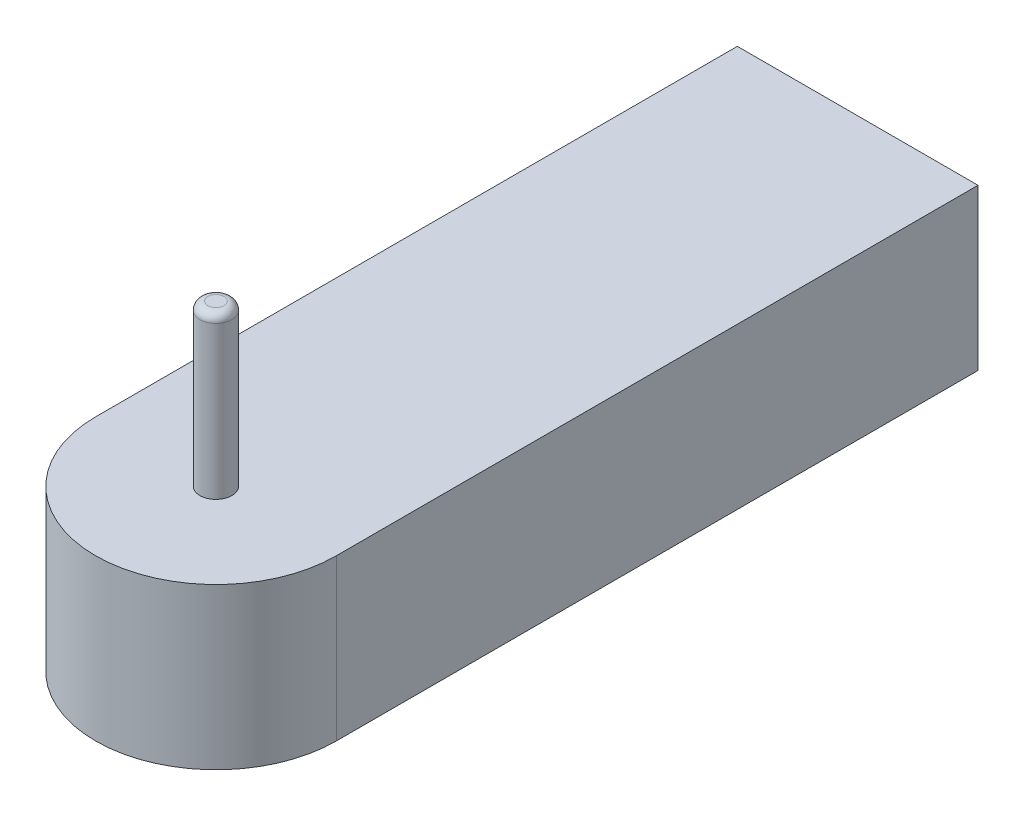
ISO-10303-21;
HEADER;
FILE_DESCRIPTION(('STEP AP214'),'2;1');
FILE_NAME('part.step','',(''),(''),'','','');
FILE_SCHEMA(('AUTOMOTIVE_DESIGN { 1 0 10303 214 1 1 1 1 }'));
ENDSEC;
DATA;
#1=APPLICATION_CONTEXT('core data for automotive mechanical design processes');
#2=APPLICATION_PROTOCOL_DEFINITION('international standard','automotive_design',2000,#1);
#3=PRODUCT_CONTEXT('',#1,'mechanical');
#4=PRODUCT('Part','Part','',(#3));
#5=PRODUCT_RELATED_PRODUCT_CATEGORY('part','',(#4));
#6=PRODUCT_DEFINITION_FORMATION('','',#4);
#7=PRODUCT_DEFINITION_CONTEXT('part definition',#1,'design');
#8=PRODUCT_DEFINITION('design','',#6,#7);
#9=PRODUCT_DEFINITION_SHAPE('','',#8);
#10=(LENGTH_UNIT() NAMED_UNIT(*) SI_UNIT(.MILLI.,.METRE.));
#11=(NAMED_UNIT(*) PLANE_ANGLE_UNIT() SI_UNIT($,.RADIAN.));
#12=(NAMED_UNIT(*) SI_UNIT($,.STERADIAN.) SOLID_ANGLE_UNIT());
#13=UNCERTAINTY_MEASURE_WITH_UNIT(LENGTH_MEASURE(1.E-05),#10,'distance_accuracy_value','');
#14=(GEOMETRIC_REPRESENTATION_CONTEXT(3) GLOBAL_UNCERTAINTY_ASSIGNED_CONTEXT((#13)) GLOBAL_UNIT_ASSIGNED_CONTEXT((#10,
#11,#12)) REPRESENTATION_CONTEXT('',''));
#15=CARTESIAN_POINT('',(0.,0.,0.));
#16=DIRECTION('',(0.,0.,1.));
#17=DIRECTION('',(1.,0.,0.));
#18=AXIS2_PLACEMENT_3D('',#15,#16,#17);
#19=CARTESIAN_POINT('',(75.0000000000001,100.,400.));
#20=DIRECTION('',(0.,1.,0.));
#21=DIRECTION('',(0.,0.,1.));
#22=AXIS2_PLACEMENT_3D('',#19,#20,#21);
#23=PLANE('',#22);
#24=DIRECTION('',(0.,0.,1.));
#25=VECTOR('',#24,1.);
#26=CARTESIAN_POINT('',(0.,100.,0.));
#27=LINE('',#26,#25);
#28=CARTESIAN_POINT('',(0.,100.,0.));
#29=VERTEX_POINT('',#28);
#30=CARTESIAN_POINT('',(0.,100.,400.));
#31=VERTEX_POINT('',#30);
#32=EDGE_CURVE('E89',#29,#31,#27,.T.);
#33=ORIENTED_EDGE('',*,*,#32,.T.);
#34=CARTESIAN_POINT('',(75.0000000000001,100.,400.));
#35=DIRECTION('',(0.,1.,0.));
#36=DIRECTION('',(0.,0.,1.));
#37=AXIS2_PLACEMENT_3D('',#34,#35,#36);
#38=CIRCLE('',#37,75.);
#39=CARTESIAN_POINT('',(150.,100.,400.));
#40=VERTEX_POINT('',#39);
#41=EDGE_CURVE('E84',#31,#40,#38,.T.);
#42=ORIENTED_EDGE('',*,*,#41,.T.);
#43=DIRECTION('',(0.,0.,-1.));
#44=VECTOR('',#43,1.);
#45=CARTESIAN_POINT('',(150.,100.,0.));
#46=LINE('',#45,#44);
#47=CARTESIAN_POINT('',(150.,100.,0.));
#48=VERTEX_POINT('',#47);
#49=EDGE_CURVE('E87',#40,#48,#46,.T.);
#50=ORIENTED_EDGE('',*,*,#49,.T.);
#51=DIRECTION('',(-1.,0.,0.));
#52=VECTOR('',#51,1.);
#53=CARTESIAN_POINT('',(0.,100.,0.));
#54=LINE('',#53,#52);
#55=EDGE_CURVE('E53',#48,#29,#54,.T.);
#56=ORIENTED_EDGE('',*,*,#55,.T.);
#57=EDGE_LOOP('',(#33,#42,#50,#56));
#58=FACE_BOUND('',#57,.T.);
#59=CARTESIAN_POINT('',(75.0000000000001,100.,400.));
#60=DIRECTION('',(0.,1.,0.));
#61=DIRECTION('',(0.,0.,1.));
#62=AXIS2_PLACEMENT_3D('',#59,#60,#61);
#63=CIRCLE('',#62,10.);
#64=CARTESIAN_POINT('',(75.0000000000001,100.,410.));
#65=VERTEX_POINT('',#64);
#66=EDGE_CURVE('E107',#65,#65,#63,.T.);
#67=ORIENTED_EDGE('',*,*,#66,.F.);
#68=EDGE_LOOP('',(#67));
#69=FACE_BOUND('',#68,.T.);
#70=ADVANCED_FACE('F36',(#58,#69),#23,.T.);
#71=CARTESIAN_POINT('',(0.,100.,0.));
#72=DIRECTION('',(1.,0.,0.));
#73=DIRECTION('',(0.,0.,-1.));
#74=AXIS2_PLACEMENT_3D('',#71,#72,#73);
#75=PLANE('',#74);
#76=DIRECTION('',(0.,0.,1.));
#77=VECTOR('',#76,1.);
#78=CARTESIAN_POINT('',(0.,0.,0.));
#79=LINE('',#78,#77);
#80=CARTESIAN_POINT('',(0.,0.,0.));
#81=VERTEX_POINT('',#80);
#82=CARTESIAN_POINT('',(0.,0.,400.));
#83=VERTEX_POINT('',#82);
#84=EDGE_CURVE('E104',#81,#83,#79,.T.);
#85=ORIENTED_EDGE('',*,*,#84,.T.);
#86=DIRECTION('',(0.,-1.,0.));
#87=VECTOR('',#86,1.);
#88=CARTESIAN_POINT('',(0.,100.,400.));
#89=LINE('',#88,#87);
#90=EDGE_CURVE('E95',#31,#83,#89,.T.);
#91=ORIENTED_EDGE('',*,*,#90,.F.);
#92=ORIENTED_EDGE('',*,*,#32,.F.);
#93=DIRECTION('',(0.,-1.,0.));
#94=VECTOR('',#93,1.);
#95=CARTESIAN_POINT('',(0.,100.,0.));
#96=LINE('',#95,#94);
#97=EDGE_CURVE('E100',#29,#81,#96,.T.);
#98=ORIENTED_EDGE('',*,*,#97,.T.);
#99=EDGE_LOOP('',(#85,#91,#92,#98));
#100=FACE_BOUND('',#99,.T.);
#101=ADVANCED_FACE('F127',(#100),#75,.F.);
#102=CARTESIAN_POINT('',(75.0000000000001,100.,400.));
#103=DIRECTION('',(0.,-1.,0.));
#104=DIRECTION('',(0.,0.,-1.));
#105=AXIS2_PLACEMENT_3D('',#102,#103,#104);
#106=CYLINDRICAL_SURFACE('',#105,75.);
#107=CARTESIAN_POINT('',(75.0000000000001,0.,400.));
#108=DIRECTION('',(0.,1.,0.));
#109=DIRECTION('',(0.,0.,1.));
#110=AXIS2_PLACEMENT_3D('',#107,#108,#109);
#111=CIRCLE('',#110,75.);
#112=CARTESIAN_POINT('',(150.,0.,400.));
#113=VERTEX_POINT('',#112);
#114=EDGE_CURVE('E94',#83,#113,#111,.T.);
#115=ORIENTED_EDGE('',*,*,#114,.T.);
#116=DIRECTION('',(0.,-1.,0.));
#117=VECTOR('',#116,1.);
#118=CARTESIAN_POINT('',(150.,100.,400.));
#119=LINE('',#118,#117);
#120=EDGE_CURVE('E92',#40,#113,#119,.T.);
#121=ORIENTED_EDGE('',*,*,#120,.F.);
#122=ORIENTED_EDGE('',*,*,#41,.F.);
#123=ORIENTED_EDGE('',*,*,#90,.T.);
#124=EDGE_LOOP('',(#115,#121,#122,#123));
#125=FACE_BOUND('',#124,.T.);
#126=ADVANCED_FACE('F93',(#125),#106,.T.);
#127=CARTESIAN_POINT('',(150.,100.,0.));
#128=DIRECTION('',(-1.,0.,0.));
#129=DIRECTION('',(0.,0.,1.));
#130=AXIS2_PLACEMENT_3D('',#127,#128,#129);
#131=PLANE('',#130);
#132=DIRECTION('',(0.,0.,-1.));
#133=VECTOR('',#132,1.);
#134=CARTESIAN_POINT('',(150.,0.,0.));
#135=LINE('',#134,#133);
#136=CARTESIAN_POINT('',(150.,0.,0.));
#137=VERTEX_POINT('',#136);
#138=EDGE_CURVE('E70',#113,#137,#135,.T.);
#139=ORIENTED_EDGE('',*,*,#138,.T.);
#140=DIRECTION('',(0.,-1.,0.));
#141=VECTOR('',#140,1.);
#142=CARTESIAN_POINT('',(150.,100.,0.));
#143=LINE('',#142,#141);
#144=EDGE_CURVE('E96',#48,#137,#143,.T.);
#145=ORIENTED_EDGE('',*,*,#144,.F.);
#146=ORIENTED_EDGE('',*,*,#49,.F.);
#147=ORIENTED_EDGE('',*,*,#120,.T.);
#148=EDGE_LOOP('',(#139,#145,#146,#147));
#149=FACE_BOUND('',#148,.T.);
#150=ADVANCED_FACE('F98',(#149),#131,.F.);
#151=CARTESIAN_POINT('',(0.,100.,0.));
#152=DIRECTION('',(0.,0.,1.));
#153=DIRECTION('',(1.,0.,0.));
#154=AXIS2_PLACEMENT_3D('',#151,#152,#153);
#155=PLANE('',#154);
#156=DIRECTION('',(-1.,0.,0.));
#157=VECTOR('',#156,1.);
#158=CARTESIAN_POINT('',(0.,0.,0.));
#159=LINE('',#158,#157);
#160=EDGE_CURVE('E76',#137,#81,#159,.T.);
#161=ORIENTED_EDGE('',*,*,#160,.T.);
#162=ORIENTED_EDGE('',*,*,#97,.F.);
#163=ORIENTED_EDGE('',*,*,#55,.F.);
#164=ORIENTED_EDGE('',*,*,#144,.T.);
#165=EDGE_LOOP('',(#161,#162,#163,#164));
#166=FACE_BOUND('',#165,.T.);
#167=ADVANCED_FACE('F138',(#166),#155,.F.);
#168=CARTESIAN_POINT('',(75.0000000000001,0.,400.));
#169=DIRECTION('',(0.,1.,0.));
#170=DIRECTION('',(0.,0.,1.));
#171=AXIS2_PLACEMENT_3D('',#168,#169,#170);
#172=PLANE('',#171);
#173=ORIENTED_EDGE('',*,*,#84,.F.);
#174=ORIENTED_EDGE('',*,*,#160,.F.);
#175=ORIENTED_EDGE('',*,*,#138,.F.);
#176=ORIENTED_EDGE('',*,*,#114,.F.);
#177=EDGE_LOOP('',(#173,#174,#175,#176));
#178=FACE_BOUND('',#177,.T.);
#179=ADVANCED_FACE('F135',(#178),#172,.F.);
#180=CARTESIAN_POINT('',(75.0000000000001,200.,400.));
#181=DIRECTION('',(0.,-1.,0.));
#182=DIRECTION('',(0.,0.,-1.));
#183=AXIS2_PLACEMENT_3D('',#180,#181,#182);
#184=CYLINDRICAL_SURFACE('',#183,10.);
#185=CARTESIAN_POINT('',(75.0000000000001,195.,400.));
#186=DIRECTION('',(0.,1.,0.));
#187=DIRECTION('',(0.,0.,1.));
#188=AXIS2_PLACEMENT_3D('',#185,#186,#187);
#189=CIRCLE('',#188,10.);
#190=CARTESIAN_POINT('',(75.0000000000001,195.,410.));
#191=VERTEX_POINT('',#190);
#192=EDGE_CURVE('E11',#191,#191,#189,.F.);
#193=ORIENTED_EDGE('',*,*,#192,.T.);
#194=EDGE_LOOP('',(#193));
#195=FACE_BOUND('',#194,.T.);
#196=ORIENTED_EDGE('',*,*,#66,.T.);
#197=EDGE_LOOP('',(#196));
#198=FACE_BOUND('',#197,.T.);
#199=ADVANCED_FACE('F123',(#195,#198),#184,.T.);
#200=CARTESIAN_POINT('',(75.0000000000001,200.,400.));
#201=DIRECTION('',(0.,1.,0.));
#202=DIRECTION('',(0.,0.,1.));
#203=AXIS2_PLACEMENT_3D('',#200,#201,#202);
#204=PLANE('',#203);
#205=CARTESIAN_POINT('',(75.0000000000001,200.,400.));
#206=DIRECTION('',(0.,1.,0.));
#207=DIRECTION('',(0.,0.,1.));
#208=AXIS2_PLACEMENT_3D('',#205,#206,#207);
#209=CIRCLE('',#208,5.);
#210=CARTESIAN_POINT('',(75.0000000000001,200.,405.));
#211=VERTEX_POINT('',#210);
#212=EDGE_CURVE('E45',#211,#211,#209,.T.);
#213=ORIENTED_EDGE('',*,*,#212,.T.);
#214=EDGE_LOOP('',(#213));
#215=FACE_BOUND('',#214,.T.);
#216=ADVANCED_FACE('F116',(#215),#204,.T.);
#217=CARTESIAN_POINT('',(75.0000000000001,195.,400.));
#218=DIRECTION('',(0.,1.,0.));
#219=DIRECTION('',(0.,0.,1.));
#220=AXIS2_PLACEMENT_3D('',#217,#218,#219);
#221=DEGENERATE_TOROIDAL_SURFACE('',#220,5.,5.,.T.);
#222=ORIENTED_EDGE('',*,*,#192,.F.);
#223=EDGE_LOOP('',(#222));
#224=FACE_BOUND('',#223,.T.);
#225=ORIENTED_EDGE('',*,*,#212,.F.);
#226=EDGE_LOOP('',(#225));
#227=FACE_BOUND('',#226,.T.);
#228=ADVANCED_FACE('F38',(#224,#227),#221,.T.);
#229=CLOSED_SHELL('',(#70,#101,#126,#150,#167,#179,#199,#216,#228));
#230=MANIFOLD_SOLID_BREP('B2',#229);
#231=ADVANCED_BREP_SHAPE_REPRESENTATION('',(#18,#230),#14);
#232=SHAPE_DEFINITION_REPRESENTATION(#9,#231);
ENDSEC;
END-ISO-10303-21;
